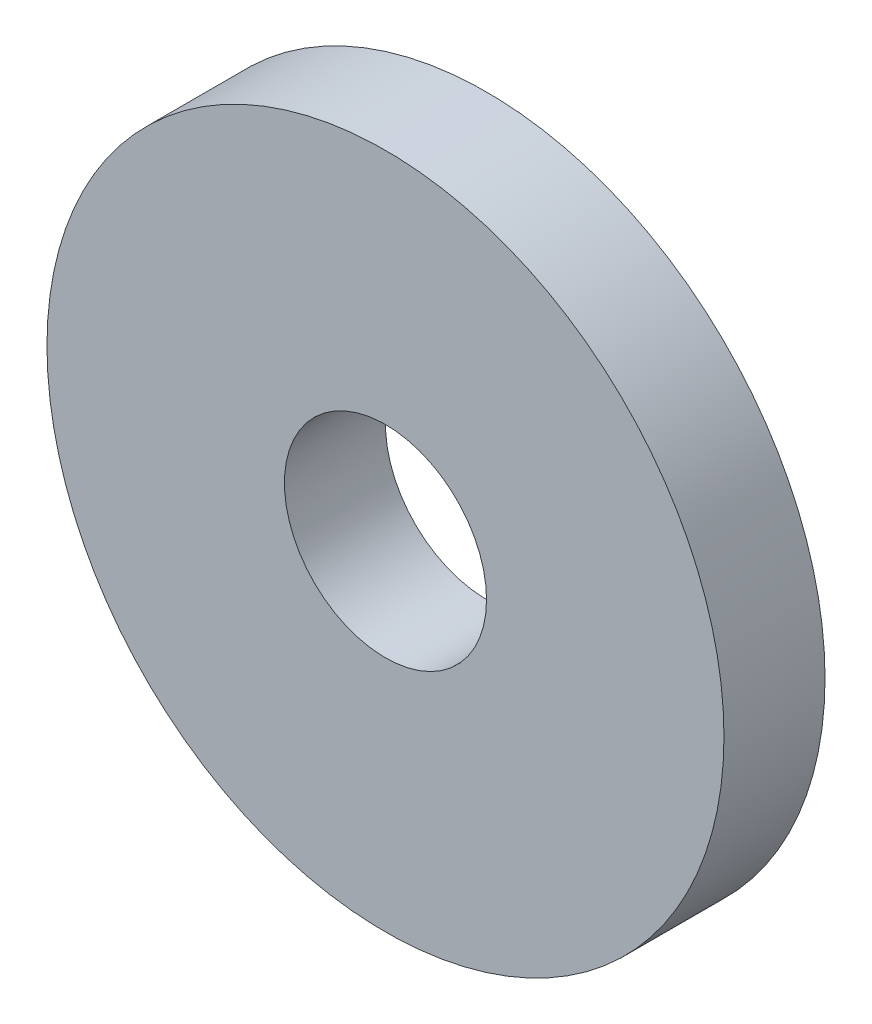
ISO-10303-21;
HEADER;
FILE_DESCRIPTION(('STEP AP214'),'2;1');
FILE_NAME('part.step','',(''),(''),'','','');
FILE_SCHEMA(('AUTOMOTIVE_DESIGN { 1 0 10303 214 1 1 1 1 }'));
ENDSEC;
DATA;
#1=APPLICATION_CONTEXT('core data for automotive mechanical design processes');
#2=APPLICATION_PROTOCOL_DEFINITION('international standard','automotive_design',2000,#1);
#3=PRODUCT_CONTEXT('',#1,'mechanical');
#4=PRODUCT('Part','Part','',(#3));
#5=PRODUCT_RELATED_PRODUCT_CATEGORY('part','',(#4));
#6=PRODUCT_DEFINITION_FORMATION('','',#4);
#7=PRODUCT_DEFINITION_CONTEXT('part definition',#1,'design');
#8=PRODUCT_DEFINITION('design','',#6,#7);
#9=PRODUCT_DEFINITION_SHAPE('','',#8);
#10=(LENGTH_UNIT() NAMED_UNIT(*) SI_UNIT(.MILLI.,.METRE.));
#11=(NAMED_UNIT(*) PLANE_ANGLE_UNIT() SI_UNIT($,.RADIAN.));
#12=(NAMED_UNIT(*) SI_UNIT($,.STERADIAN.) SOLID_ANGLE_UNIT());
#13=UNCERTAINTY_MEASURE_WITH_UNIT(LENGTH_MEASURE(1.E-05),#10,'distance_accuracy_value','');
#14=(GEOMETRIC_REPRESENTATION_CONTEXT(3) GLOBAL_UNCERTAINTY_ASSIGNED_CONTEXT((#13)) GLOBAL_UNIT_ASSIGNED_CONTEXT((#10,
#11,#12)) REPRESENTATION_CONTEXT('',''));
#15=CARTESIAN_POINT('',(0.,0.,0.));
#16=DIRECTION('',(0.,0.,1.));
#17=DIRECTION('',(1.,0.,0.));
#18=AXIS2_PLACEMENT_3D('',#15,#16,#17);
#19=CARTESIAN_POINT('',(0.577382650194774,0.0962304416991383,3.));
#20=DIRECTION('',(0.,0.,1.));
#21=DIRECTION('',(1.,0.,0.));
#22=AXIS2_PLACEMENT_3D('',#19,#20,#21);
#23=PLANE('',#22);
#24=CARTESIAN_POINT('',(0.577382650194774,0.0962304416991383,3.));
#25=DIRECTION('',(0.,0.,1.));
#26=DIRECTION('',(1.,0.,0.));
#27=AXIS2_PLACEMENT_3D('',#24,#25,#26);
#28=CIRCLE('',#27,10.0498756211209);
#29=CARTESIAN_POINT('',(10.6272582713157,0.0962304416991383,3.));
#30=VERTEX_POINT('',#29);
#31=EDGE_CURVE('E10',#30,#30,#28,.T.);
#32=ORIENTED_EDGE('',*,*,#31,.T.);
#33=EDGE_LOOP('',(#32));
#34=FACE_BOUND('',#33,.T.);
#35=CARTESIAN_POINT('',(0.577382650194774,0.0962304416991383,3.));
#36=DIRECTION('',(0.,0.,1.));
#37=DIRECTION('',(1.,0.,0.));
#38=AXIS2_PLACEMENT_3D('',#35,#36,#37);
#39=CIRCLE('',#38,3.);
#40=CARTESIAN_POINT('',(3.57738265019478,0.0962304416991383,3.));
#41=VERTEX_POINT('',#40);
#42=EDGE_CURVE('E54',#41,#41,#39,.T.);
#43=ORIENTED_EDGE('',*,*,#42,.F.);
#44=EDGE_LOOP('',(#43));
#45=FACE_BOUND('',#44,.T.);
#46=ADVANCED_FACE('F41',(#34,#45),#23,.T.);
#47=CARTESIAN_POINT('',(0.577382650194774,0.0962304416991383,0.));
#48=DIRECTION('',(0.,0.,1.));
#49=DIRECTION('',(1.,0.,0.));
#50=AXIS2_PLACEMENT_3D('',#47,#48,#49);
#51=PLANE('',#50);
#52=CARTESIAN_POINT('',(0.577382650194774,0.0962304416991383,0.));
#53=DIRECTION('',(0.,0.,1.));
#54=DIRECTION('',(1.,0.,0.));
#55=AXIS2_PLACEMENT_3D('',#52,#53,#54);
#56=CIRCLE('',#55,10.0498756211209);
#57=CARTESIAN_POINT('',(10.6272582713157,0.0962304416991383,0.));
#58=VERTEX_POINT('',#57);
#59=EDGE_CURVE('E45',#58,#58,#56,.T.);
#60=ORIENTED_EDGE('',*,*,#59,.F.);
#61=EDGE_LOOP('',(#60));
#62=FACE_BOUND('',#61,.T.);
#63=CARTESIAN_POINT('',(0.577382650194774,0.0962304416991383,0.));
#64=DIRECTION('',(0.,0.,1.));
#65=DIRECTION('',(1.,0.,0.));
#66=AXIS2_PLACEMENT_3D('',#63,#64,#65);
#67=CIRCLE('',#66,3.);
#68=CARTESIAN_POINT('',(3.57738265019478,0.0962304416991383,0.));
#69=VERTEX_POINT('',#68);
#70=EDGE_CURVE('E56',#69,#69,#67,.T.);
#71=ORIENTED_EDGE('',*,*,#70,.T.);
#72=EDGE_LOOP('',(#71));
#73=FACE_BOUND('',#72,.T.);
#74=ADVANCED_FACE('F68',(#62,#73),#51,.F.);
#75=CARTESIAN_POINT('',(0.577382650194774,0.0962304416991383,3.));
#76=DIRECTION('',(0.,0.,-1.));
#77=DIRECTION('',(-1.,0.,0.));
#78=AXIS2_PLACEMENT_3D('',#75,#76,#77);
#79=CYLINDRICAL_SURFACE('',#78,10.0498756211209);
#80=ORIENTED_EDGE('',*,*,#31,.F.);
#81=EDGE_LOOP('',(#80));
#82=FACE_BOUND('',#81,.T.);
#83=ORIENTED_EDGE('',*,*,#59,.T.);
#84=EDGE_LOOP('',(#83));
#85=FACE_BOUND('',#84,.T.);
#86=ADVANCED_FACE('F43',(#82,#85),#79,.T.);
#87=CARTESIAN_POINT('',(0.577382650194774,0.0962304416991383,3.));
#88=DIRECTION('',(0.,0.,-1.));
#89=DIRECTION('',(-1.,0.,0.));
#90=AXIS2_PLACEMENT_3D('',#87,#88,#89);
#91=CYLINDRICAL_SURFACE('',#90,3.);
#92=ORIENTED_EDGE('',*,*,#42,.T.);
#93=EDGE_LOOP('',(#92));
#94=FACE_BOUND('',#93,.T.);
#95=ORIENTED_EDGE('',*,*,#70,.F.);
#96=EDGE_LOOP('',(#95));
#97=FACE_BOUND('',#96,.T.);
#98=ADVANCED_FACE('F64',(#94,#97),#91,.F.);
#99=CLOSED_SHELL('',(#46,#74,#86,#98));
#100=MANIFOLD_SOLID_BREP('B2',#99);
#101=ADVANCED_BREP_SHAPE_REPRESENTATION('',(#18,#100),#14);
#102=SHAPE_DEFINITION_REPRESENTATION(#9,#101);
ENDSEC;
END-ISO-10303-21;
